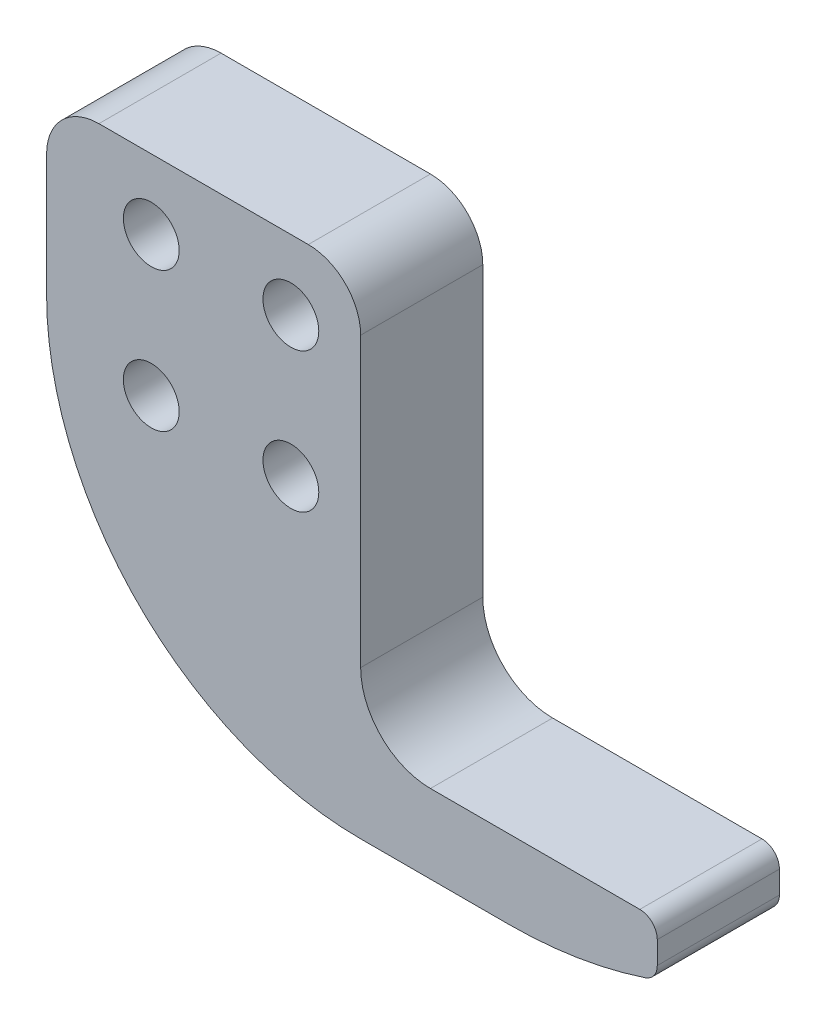
ISO-10303-21;
HEADER;
FILE_DESCRIPTION(('STEP AP214'),'2;1');
FILE_NAME('part.step','',(''),(''),'','','');
FILE_SCHEMA(('AUTOMOTIVE_DESIGN { 1 0 10303 214 1 1 1 1 }'));
ENDSEC;
DATA;
#1=APPLICATION_CONTEXT('core data for automotive mechanical design processes');
#2=APPLICATION_PROTOCOL_DEFINITION('international standard','automotive_design',2000,#1);
#3=PRODUCT_CONTEXT('',#1,'mechanical');
#4=PRODUCT('Part','Part','',(#3));
#5=PRODUCT_RELATED_PRODUCT_CATEGORY('part','',(#4));
#6=PRODUCT_DEFINITION_FORMATION('','',#4);
#7=PRODUCT_DEFINITION_CONTEXT('part definition',#1,'design');
#8=PRODUCT_DEFINITION('design','',#6,#7);
#9=PRODUCT_DEFINITION_SHAPE('','',#8);
#10=(LENGTH_UNIT() NAMED_UNIT(*) SI_UNIT(.MILLI.,.METRE.));
#11=(NAMED_UNIT(*) PLANE_ANGLE_UNIT() SI_UNIT($,.RADIAN.));
#12=(NAMED_UNIT(*) SI_UNIT($,.STERADIAN.) SOLID_ANGLE_UNIT());
#13=UNCERTAINTY_MEASURE_WITH_UNIT(LENGTH_MEASURE(1.E-05),#10,'distance_accuracy_value','');
#14=(GEOMETRIC_REPRESENTATION_CONTEXT(3) GLOBAL_UNCERTAINTY_ASSIGNED_CONTEXT((#13)) GLOBAL_UNIT_ASSIGNED_CONTEXT((#10,
#11,#12)) REPRESENTATION_CONTEXT('',''));
#15=CARTESIAN_POINT('',(0.,0.,0.));
#16=DIRECTION('',(0.,0.,1.));
#17=DIRECTION('',(1.,0.,0.));
#18=AXIS2_PLACEMENT_3D('',#15,#16,#17);
#19=CARTESIAN_POINT('',(-99.1545902943916,66.5,3.5));
#20=DIRECTION('',(0.,0.,1.));
#21=DIRECTION('',(1.,0.,0.));
#22=AXIS2_PLACEMENT_3D('',#19,#20,#21);
#23=PLANE('',#22);
#24=CARTESIAN_POINT('',(-103.154590294392,72.5,3.5));
#25=DIRECTION('',(0.,0.,1.));
#26=DIRECTION('',(1.,0.,0.));
#27=AXIS2_PLACEMENT_3D('',#24,#25,#26);
#28=CIRCLE('',#27,1.59999999999999);
#29=CARTESIAN_POINT('',(-101.554590294392,72.5,3.5));
#30=VERTEX_POINT('',#29);
#31=EDGE_CURVE('E196',#30,#30,#28,.T.);
#32=ORIENTED_EDGE('',*,*,#31,.F.);
#33=EDGE_LOOP('',(#32));
#34=FACE_BOUND('',#33,.T.);
#35=CARTESIAN_POINT('',(-111.154590294392,72.5,3.5));
#36=DIRECTION('',(0.,0.,1.));
#37=DIRECTION('',(1.,0.,0.));
#38=AXIS2_PLACEMENT_3D('',#35,#36,#37);
#39=CIRCLE('',#38,1.59999999999999);
#40=CARTESIAN_POINT('',(-109.554590294392,72.5,3.5));
#41=VERTEX_POINT('',#40);
#42=EDGE_CURVE('E422',#41,#41,#39,.T.);
#43=ORIENTED_EDGE('',*,*,#42,.F.);
#44=EDGE_LOOP('',(#43));
#45=FACE_BOUND('',#44,.T.);
#46=CARTESIAN_POINT('',(-111.154590294392,64.5,3.5));
#47=DIRECTION('',(0.,0.,1.));
#48=DIRECTION('',(1.,0.,0.));
#49=AXIS2_PLACEMENT_3D('',#46,#47,#48);
#50=CIRCLE('',#49,1.59999999999999);
#51=CARTESIAN_POINT('',(-109.554590294392,64.5,3.5));
#52=VERTEX_POINT('',#51);
#53=EDGE_CURVE('E424',#52,#52,#50,.T.);
#54=ORIENTED_EDGE('',*,*,#53,.F.);
#55=EDGE_LOOP('',(#54));
#56=FACE_BOUND('',#55,.T.);
#57=CARTESIAN_POINT('',(-103.154590294392,64.5,3.5));
#58=DIRECTION('',(0.,0.,1.));
#59=DIRECTION('',(1.,0.,0.));
#60=AXIS2_PLACEMENT_3D('',#57,#58,#59);
#61=CIRCLE('',#60,1.60000000000001);
#62=CARTESIAN_POINT('',(-101.554590294392,64.5,3.5));
#63=VERTEX_POINT('',#62);
#64=EDGE_CURVE('E153',#63,#63,#61,.T.);
#65=ORIENTED_EDGE('',*,*,#64,.F.);
#66=EDGE_LOOP('',(#65));
#67=FACE_BOUND('',#66,.T.);
#68=DIRECTION('',(0.,-1.,0.));
#69=VECTOR('',#68,1.);
#70=CARTESIAN_POINT('',(-99.1545902943916,76.5,3.5));
#71=LINE('',#70,#69);
#72=CARTESIAN_POINT('',(-99.1545902943916,73.5,3.5));
#73=VERTEX_POINT('',#72);
#74=CARTESIAN_POINT('',(-99.1545902943916,57.,3.5));
#75=VERTEX_POINT('',#74);
#76=EDGE_CURVE('E249',#73,#75,#71,.T.);
#77=ORIENTED_EDGE('',*,*,#76,.F.);
#78=CARTESIAN_POINT('',(-102.154590294392,73.5,3.5));
#79=DIRECTION('',(0.,0.,1.));
#80=DIRECTION('',(1.,0.,0.));
#81=AXIS2_PLACEMENT_3D('',#78,#79,#80);
#82=CIRCLE('',#81,3.);
#83=CARTESIAN_POINT('',(-102.154590294392,76.5,3.5));
#84=VERTEX_POINT('',#83);
#85=EDGE_CURVE('E235',#73,#84,#82,.T.);
#86=ORIENTED_EDGE('',*,*,#85,.T.);
#87=DIRECTION('',(1.,0.,0.));
#88=VECTOR('',#87,1.);
#89=CARTESIAN_POINT('',(-117.154590294392,76.5,3.5));
#90=LINE('',#89,#88);
#91=CARTESIAN_POINT('',(-114.154590294392,76.5,3.5));
#92=VERTEX_POINT('',#91);
#93=EDGE_CURVE('E186',#92,#84,#90,.T.);
#94=ORIENTED_EDGE('',*,*,#93,.F.);
#95=CARTESIAN_POINT('',(-114.154590294392,73.5,3.5));
#96=DIRECTION('',(0.,0.,1.));
#97=DIRECTION('',(1.,0.,0.));
#98=AXIS2_PLACEMENT_3D('',#95,#96,#97);
#99=CIRCLE('',#98,3.);
#100=CARTESIAN_POINT('',(-117.154590294392,73.5,3.5));
#101=VERTEX_POINT('',#100);
#102=EDGE_CURVE('E233',#92,#101,#99,.T.);
#103=ORIENTED_EDGE('',*,*,#102,.T.);
#104=DIRECTION('',(0.,-1.,0.));
#105=VECTOR('',#104,1.);
#106=CARTESIAN_POINT('',(-117.154590294392,76.5,3.5));
#107=LINE('',#106,#105);
#108=CARTESIAN_POINT('',(-117.154590294392,66.5,3.5));
#109=VERTEX_POINT('',#108);
#110=EDGE_CURVE('E161',#101,#109,#107,.T.);
#111=ORIENTED_EDGE('',*,*,#110,.T.);
#112=CARTESIAN_POINT('',(-99.1545902943916,66.5,3.5));
#113=DIRECTION('',(0.,0.,1.));
#114=DIRECTION('',(1.,0.,0.));
#115=AXIS2_PLACEMENT_3D('',#112,#113,#114);
#116=CIRCLE('',#115,18.);
#117=CARTESIAN_POINT('',(-99.1545902943916,48.5,3.5));
#118=VERTEX_POINT('',#117);
#119=EDGE_CURVE('E157',#109,#118,#116,.T.);
#120=ORIENTED_EDGE('',*,*,#119,.T.);
#121=DIRECTION('',(1.,0.,0.));
#122=VECTOR('',#121,1.);
#123=CARTESIAN_POINT('',(-99.1545902943916,48.5,3.5));
#124=LINE('',#123,#122);
#125=CARTESIAN_POINT('',(-90.6839513490076,48.5,3.5));
#126=VERTEX_POINT('',#125);
#127=EDGE_CURVE('E150',#118,#126,#124,.T.);
#128=ORIENTED_EDGE('',*,*,#127,.T.);
#129=CARTESIAN_POINT('',(-90.6839513490076,73.5,3.5));
#130=DIRECTION('',(0.,0.,-1.));
#131=DIRECTION('',(1.,0.,0.));
#132=AXIS2_PLACEMENT_3D('',#129,#130,#131);
#133=CIRCLE('',#132,25.);
#134=CARTESIAN_POINT('',(-82.840866917116,49.7621393846409,3.5));
#135=VERTEX_POINT('',#134);
#136=EDGE_CURVE('E135',#135,#126,#133,.T.);
#137=ORIENTED_EDGE('',*,*,#136,.F.);
#138=CARTESIAN_POINT('',(-83.1545902943916,50.7116538092553,3.5));
#139=DIRECTION('',(0.,0.,1.));
#140=DIRECTION('',(1.,0.,0.));
#141=AXIS2_PLACEMENT_3D('',#138,#139,#140);
#142=CIRCLE('',#141,1.);
#143=CARTESIAN_POINT('',(-82.1545902943916,50.7116538092553,3.5));
#144=VERTEX_POINT('',#143);
#145=EDGE_CURVE('E216',#135,#144,#142,.T.);
#146=ORIENTED_EDGE('',*,*,#145,.T.);
#147=DIRECTION('',(0.,-1.,0.));
#148=VECTOR('',#147,1.);
#149=CARTESIAN_POINT('',(-82.1545902943916,53.,3.5));
#150=LINE('',#149,#148);
#151=CARTESIAN_POINT('',(-82.1545902943916,52.,3.5));
#152=VERTEX_POINT('',#151);
#153=EDGE_CURVE('E159',#152,#144,#150,.T.);
#154=ORIENTED_EDGE('',*,*,#153,.F.);
#155=CARTESIAN_POINT('',(-83.1545902943916,52.,3.5));
#156=DIRECTION('',(0.,0.,1.));
#157=DIRECTION('',(1.,0.,0.));
#158=AXIS2_PLACEMENT_3D('',#155,#156,#157);
#159=CIRCLE('',#158,1.);
#160=CARTESIAN_POINT('',(-83.1545902943916,53.,3.5));
#161=VERTEX_POINT('',#160);
#162=EDGE_CURVE('E218',#152,#161,#159,.T.);
#163=ORIENTED_EDGE('',*,*,#162,.T.);
#164=DIRECTION('',(1.,0.,0.));
#165=VECTOR('',#164,1.);
#166=CARTESIAN_POINT('',(-99.1545902943916,53.,3.5));
#167=LINE('',#166,#165);
#168=CARTESIAN_POINT('',(-95.1545902943916,53.,3.5));
#169=VERTEX_POINT('',#168);
#170=EDGE_CURVE('E164',#169,#161,#167,.T.);
#171=ORIENTED_EDGE('',*,*,#170,.F.);
#172=CARTESIAN_POINT('',(-95.1545902943916,57.,3.5));
#173=DIRECTION('',(0.,0.,1.));
#174=DIRECTION('',(1.,0.,0.));
#175=AXIS2_PLACEMENT_3D('',#172,#173,#174);
#176=CIRCLE('',#175,4.);
#177=EDGE_CURVE('E11',#169,#75,#176,.F.);
#178=ORIENTED_EDGE('',*,*,#177,.T.);
#179=EDGE_LOOP('',(#77,#86,#94,#103,#111,#120,#128,#137,#146,#154,#163,#171,#178));
#180=FACE_BOUND('',#179,.T.);
#181=ADVANCED_FACE('F41',(#34,#45,#56,#67,#180),#23,.T.);
#182=CARTESIAN_POINT('',(-99.1545902943916,66.5,-3.5));
#183=DIRECTION('',(0.,0.,1.));
#184=DIRECTION('',(1.,0.,0.));
#185=AXIS2_PLACEMENT_3D('',#182,#183,#184);
#186=PLANE('',#185);
#187=CARTESIAN_POINT('',(-103.154590294392,64.5,-3.5));
#188=DIRECTION('',(0.,0.,1.));
#189=DIRECTION('',(1.,0.,0.));
#190=AXIS2_PLACEMENT_3D('',#187,#188,#189);
#191=CIRCLE('',#190,1.60000000000001);
#192=CARTESIAN_POINT('',(-101.554590294392,64.5,-3.5));
#193=VERTEX_POINT('',#192);
#194=EDGE_CURVE('E174',#193,#193,#191,.T.);
#195=ORIENTED_EDGE('',*,*,#194,.T.);
#196=EDGE_LOOP('',(#195));
#197=FACE_BOUND('',#196,.T.);
#198=CARTESIAN_POINT('',(-111.154590294392,64.5,-3.5));
#199=DIRECTION('',(0.,0.,1.));
#200=DIRECTION('',(1.,0.,0.));
#201=AXIS2_PLACEMENT_3D('',#198,#199,#200);
#202=CIRCLE('',#201,1.59999999999999);
#203=CARTESIAN_POINT('',(-109.554590294392,64.5,-3.5));
#204=VERTEX_POINT('',#203);
#205=EDGE_CURVE('E199',#204,#204,#202,.T.);
#206=ORIENTED_EDGE('',*,*,#205,.T.);
#207=EDGE_LOOP('',(#206));
#208=FACE_BOUND('',#207,.T.);
#209=CARTESIAN_POINT('',(-111.154590294392,72.5,-3.5));
#210=DIRECTION('',(0.,0.,1.));
#211=DIRECTION('',(1.,0.,0.));
#212=AXIS2_PLACEMENT_3D('',#209,#210,#211);
#213=CIRCLE('',#212,1.59999999999999);
#214=CARTESIAN_POINT('',(-109.554590294392,72.5,-3.5));
#215=VERTEX_POINT('',#214);
#216=EDGE_CURVE('E195',#215,#215,#213,.T.);
#217=ORIENTED_EDGE('',*,*,#216,.T.);
#218=EDGE_LOOP('',(#217));
#219=FACE_BOUND('',#218,.T.);
#220=CARTESIAN_POINT('',(-103.154590294392,72.5,-3.5));
#221=DIRECTION('',(0.,0.,1.));
#222=DIRECTION('',(1.,0.,0.));
#223=AXIS2_PLACEMENT_3D('',#220,#221,#222);
#224=CIRCLE('',#223,1.59999999999999);
#225=CARTESIAN_POINT('',(-101.554590294392,72.5,-3.5));
#226=VERTEX_POINT('',#225);
#227=EDGE_CURVE('E192',#226,#226,#224,.T.);
#228=ORIENTED_EDGE('',*,*,#227,.T.);
#229=EDGE_LOOP('',(#228));
#230=FACE_BOUND('',#229,.T.);
#231=DIRECTION('',(1.,0.,0.));
#232=VECTOR('',#231,1.);
#233=CARTESIAN_POINT('',(-117.154590294392,76.5,-3.5));
#234=LINE('',#233,#232);
#235=CARTESIAN_POINT('',(-114.154590294392,76.5,-3.5));
#236=VERTEX_POINT('',#235);
#237=CARTESIAN_POINT('',(-102.154590294392,76.5,-3.5));
#238=VERTEX_POINT('',#237);
#239=EDGE_CURVE('E170',#236,#238,#234,.T.);
#240=ORIENTED_EDGE('',*,*,#239,.T.);
#241=CARTESIAN_POINT('',(-102.154590294392,73.5,-3.5));
#242=DIRECTION('',(0.,0.,1.));
#243=DIRECTION('',(1.,0.,0.));
#244=AXIS2_PLACEMENT_3D('',#241,#242,#243);
#245=CIRCLE('',#244,3.);
#246=CARTESIAN_POINT('',(-99.1545902943916,73.5,-3.5));
#247=VERTEX_POINT('',#246);
#248=EDGE_CURVE('E229',#238,#247,#245,.F.);
#249=ORIENTED_EDGE('',*,*,#248,.T.);
#250=DIRECTION('',(0.,-1.,0.));
#251=VECTOR('',#250,1.);
#252=CARTESIAN_POINT('',(-99.1545902943916,76.5,-3.5));
#253=LINE('',#252,#251);
#254=CARTESIAN_POINT('',(-99.1545902943916,57.,-3.5));
#255=VERTEX_POINT('',#254);
#256=EDGE_CURVE('E173',#247,#255,#253,.T.);
#257=ORIENTED_EDGE('',*,*,#256,.T.);
#258=CARTESIAN_POINT('',(-95.1545902943916,57.,-3.5));
#259=DIRECTION('',(0.,0.,1.));
#260=DIRECTION('',(1.,0.,0.));
#261=AXIS2_PLACEMENT_3D('',#258,#259,#260);
#262=CIRCLE('',#261,4.);
#263=CARTESIAN_POINT('',(-95.1545902943916,53.,-3.5));
#264=VERTEX_POINT('',#263);
#265=EDGE_CURVE('E49',#255,#264,#262,.T.);
#266=ORIENTED_EDGE('',*,*,#265,.T.);
#267=DIRECTION('',(1.,0.,0.));
#268=VECTOR('',#267,1.);
#269=CARTESIAN_POINT('',(-99.1545902943916,53.,-3.5));
#270=LINE('',#269,#268);
#271=CARTESIAN_POINT('',(-83.1545902943916,53.,-3.5));
#272=VERTEX_POINT('',#271);
#273=EDGE_CURVE('E176',#264,#272,#270,.T.);
#274=ORIENTED_EDGE('',*,*,#273,.T.);
#275=CARTESIAN_POINT('',(-83.1545902943916,52.,-3.5));
#276=DIRECTION('',(0.,0.,1.));
#277=DIRECTION('',(1.,0.,0.));
#278=AXIS2_PLACEMENT_3D('',#275,#276,#277);
#279=CIRCLE('',#278,1.);
#280=CARTESIAN_POINT('',(-82.1545902943916,52.,-3.5));
#281=VERTEX_POINT('',#280);
#282=EDGE_CURVE('E210',#272,#281,#279,.F.);
#283=ORIENTED_EDGE('',*,*,#282,.T.);
#284=DIRECTION('',(0.,-1.,0.));
#285=VECTOR('',#284,1.);
#286=CARTESIAN_POINT('',(-82.1545902943916,53.,-3.5));
#287=LINE('',#286,#285);
#288=CARTESIAN_POINT('',(-82.1545902943916,50.7116538092553,-3.5));
#289=VERTEX_POINT('',#288);
#290=EDGE_CURVE('E178',#281,#289,#287,.T.);
#291=ORIENTED_EDGE('',*,*,#290,.T.);
#292=CARTESIAN_POINT('',(-83.1545902943916,50.7116538092553,-3.5));
#293=DIRECTION('',(0.,0.,1.));
#294=DIRECTION('',(1.,0.,0.));
#295=AXIS2_PLACEMENT_3D('',#292,#293,#294);
#296=CIRCLE('',#295,1.);
#297=CARTESIAN_POINT('',(-82.840866917116,49.7621393846409,-3.5));
#298=VERTEX_POINT('',#297);
#299=EDGE_CURVE('E208',#289,#298,#296,.F.);
#300=ORIENTED_EDGE('',*,*,#299,.T.);
#301=CARTESIAN_POINT('',(-90.6839513490076,73.5,-3.5));
#302=DIRECTION('',(0.,0.,1.));
#303=DIRECTION('',(1.,0.,0.));
#304=AXIS2_PLACEMENT_3D('',#301,#302,#303);
#305=CIRCLE('',#304,25.);
#306=CARTESIAN_POINT('',(-90.6839513490076,48.5,-3.5));
#307=VERTEX_POINT('',#306);
#308=EDGE_CURVE('E190',#298,#307,#305,.F.);
#309=ORIENTED_EDGE('',*,*,#308,.T.);
#310=DIRECTION('',(1.,0.,0.));
#311=VECTOR('',#310,1.);
#312=CARTESIAN_POINT('',(-99.1545902943916,48.5,-3.5));
#313=LINE('',#312,#311);
#314=CARTESIAN_POINT('',(-99.1545902943916,48.5,-3.5));
#315=VERTEX_POINT('',#314);
#316=EDGE_CURVE('E152',#315,#307,#313,.T.);
#317=ORIENTED_EDGE('',*,*,#316,.F.);
#318=CARTESIAN_POINT('',(-99.1545902943916,66.5,-3.5));
#319=DIRECTION('',(0.,0.,1.));
#320=DIRECTION('',(1.,0.,0.));
#321=AXIS2_PLACEMENT_3D('',#318,#319,#320);
#322=CIRCLE('',#321,18.);
#323=CARTESIAN_POINT('',(-117.154590294392,66.5,-3.5));
#324=VERTEX_POINT('',#323);
#325=EDGE_CURVE('E182',#324,#315,#322,.T.);
#326=ORIENTED_EDGE('',*,*,#325,.F.);
#327=DIRECTION('',(0.,-1.,0.));
#328=VECTOR('',#327,1.);
#329=CARTESIAN_POINT('',(-117.154590294392,76.5,-3.5));
#330=LINE('',#329,#328);
#331=CARTESIAN_POINT('',(-117.154590294392,73.5,-3.5));
#332=VERTEX_POINT('',#331);
#333=EDGE_CURVE('E184',#332,#324,#330,.T.);
#334=ORIENTED_EDGE('',*,*,#333,.F.);
#335=CARTESIAN_POINT('',(-114.154590294392,73.5,-3.5));
#336=DIRECTION('',(0.,0.,1.));
#337=DIRECTION('',(1.,0.,0.));
#338=AXIS2_PLACEMENT_3D('',#335,#336,#337);
#339=CIRCLE('',#338,3.);
#340=EDGE_CURVE('E227',#332,#236,#339,.F.);
#341=ORIENTED_EDGE('',*,*,#340,.T.);
#342=EDGE_LOOP('',(#240,#249,#257,#266,#274,#283,#291,#300,#309,#317,#326,#334,#341));
#343=FACE_BOUND('',#342,.T.);
#344=ADVANCED_FACE('F252',(#197,#208,#219,#230,#343),#186,.F.);
#345=CARTESIAN_POINT('',(-117.154590294392,76.5,3.5));
#346=DIRECTION('',(0.,1.,0.));
#347=DIRECTION('',(0.,0.,1.));
#348=AXIS2_PLACEMENT_3D('',#345,#346,#347);
#349=PLANE('',#348);
#350=ORIENTED_EDGE('',*,*,#93,.T.);
#351=DIRECTION('',(0.,0.,-1.));
#352=VECTOR('',#351,1.);
#353=CARTESIAN_POINT('',(-102.154590294392,76.5,3.5));
#354=LINE('',#353,#352);
#355=EDGE_CURVE('E224',#84,#238,#354,.T.);
#356=ORIENTED_EDGE('',*,*,#355,.T.);
#357=ORIENTED_EDGE('',*,*,#239,.F.);
#358=DIRECTION('',(0.,0.,-1.));
#359=VECTOR('',#358,1.);
#360=CARTESIAN_POINT('',(-114.154590294392,76.5,3.5));
#361=LINE('',#360,#359);
#362=EDGE_CURVE('E222',#236,#92,#361,.F.);
#363=ORIENTED_EDGE('',*,*,#362,.T.);
#364=EDGE_LOOP('',(#350,#356,#357,#363));
#365=FACE_BOUND('',#364,.T.);
#366=ADVANCED_FACE('F260',(#365),#349,.T.);
#367=CARTESIAN_POINT('',(-117.154590294392,76.5,3.5));
#368=DIRECTION('',(1.,0.,0.));
#369=DIRECTION('',(0.,0.,-1.));
#370=AXIS2_PLACEMENT_3D('',#367,#368,#369);
#371=PLANE('',#370);
#372=ORIENTED_EDGE('',*,*,#110,.F.);
#373=DIRECTION('',(0.,0.,-1.));
#374=VECTOR('',#373,1.);
#375=CARTESIAN_POINT('',(-117.154590294392,73.5,-3.5));
#376=LINE('',#375,#374);
#377=EDGE_CURVE('E237',#101,#332,#376,.T.);
#378=ORIENTED_EDGE('',*,*,#377,.T.);
#379=ORIENTED_EDGE('',*,*,#333,.T.);
#380=DIRECTION('',(0.,0.,-1.));
#381=VECTOR('',#380,1.);
#382=CARTESIAN_POINT('',(-117.154590294392,66.5,3.5));
#383=LINE('',#382,#381);
#384=EDGE_CURVE('E187',#109,#324,#383,.T.);
#385=ORIENTED_EDGE('',*,*,#384,.F.);
#386=EDGE_LOOP('',(#372,#378,#379,#385));
#387=FACE_BOUND('',#386,.T.);
#388=ADVANCED_FACE('F290',(#387),#371,.F.);
#389=CARTESIAN_POINT('',(-99.1545902943916,66.5,3.5));
#390=DIRECTION('',(0.,0.,-1.));
#391=DIRECTION('',(-1.,0.,0.));
#392=AXIS2_PLACEMENT_3D('',#389,#390,#391);
#393=CYLINDRICAL_SURFACE('',#392,18.);
#394=ORIENTED_EDGE('',*,*,#325,.T.);
#395=DIRECTION('',(0.,0.,-1.));
#396=VECTOR('',#395,1.);
#397=CARTESIAN_POINT('',(-99.1545902943916,48.5,3.5));
#398=LINE('',#397,#396);
#399=EDGE_CURVE('E169',#118,#315,#398,.T.);
#400=ORIENTED_EDGE('',*,*,#399,.F.);
#401=ORIENTED_EDGE('',*,*,#119,.F.);
#402=ORIENTED_EDGE('',*,*,#384,.T.);
#403=EDGE_LOOP('',(#394,#400,#401,#402));
#404=FACE_BOUND('',#403,.T.);
#405=ADVANCED_FACE('F286',(#404),#393,.T.);
#406=CARTESIAN_POINT('',(-99.1545902943916,48.5,3.5));
#407=DIRECTION('',(0.,1.,0.));
#408=DIRECTION('',(-1.,0.,0.));
#409=AXIS2_PLACEMENT_3D('',#406,#407,#408);
#410=PLANE('',#409);
#411=ORIENTED_EDGE('',*,*,#316,.T.);
#412=DIRECTION('',(0.,0.,1.));
#413=VECTOR('',#412,1.);
#414=CARTESIAN_POINT('',(-90.6839513490076,48.5,-9.5));
#415=LINE('',#414,#413);
#416=EDGE_CURVE('E139',#307,#126,#415,.T.);
#417=ORIENTED_EDGE('',*,*,#416,.T.);
#418=ORIENTED_EDGE('',*,*,#127,.F.);
#419=ORIENTED_EDGE('',*,*,#399,.T.);
#420=EDGE_LOOP('',(#411,#417,#418,#419));
#421=FACE_BOUND('',#420,.T.);
#422=ADVANCED_FACE('F148',(#421),#410,.F.);
#423=CARTESIAN_POINT('',(-82.1545902943916,53.,3.5));
#424=DIRECTION('',(1.,0.,0.));
#425=DIRECTION('',(0.,0.,-1.));
#426=AXIS2_PLACEMENT_3D('',#423,#424,#425);
#427=PLANE('',#426);
#428=ORIENTED_EDGE('',*,*,#290,.F.);
#429=DIRECTION('',(0.,0.,-1.));
#430=VECTOR('',#429,1.);
#431=CARTESIAN_POINT('',(-82.1545902943916,52.,3.5));
#432=LINE('',#431,#430);
#433=EDGE_CURVE('E214',#281,#152,#432,.F.);
#434=ORIENTED_EDGE('',*,*,#433,.T.);
#435=ORIENTED_EDGE('',*,*,#153,.T.);
#436=DIRECTION('',(0.,0.,-1.));
#437=VECTOR('',#436,1.);
#438=CARTESIAN_POINT('',(-82.1545902943916,50.7116538092553,-3.5));
#439=LINE('',#438,#437);
#440=EDGE_CURVE('E212',#144,#289,#439,.T.);
#441=ORIENTED_EDGE('',*,*,#440,.T.);
#442=EDGE_LOOP('',(#428,#434,#435,#441));
#443=FACE_BOUND('',#442,.T.);
#444=ADVANCED_FACE('F279',(#443),#427,.T.);
#445=CARTESIAN_POINT('',(-99.1545902943916,53.,3.5));
#446=DIRECTION('',(0.,1.,0.));
#447=DIRECTION('',(0.,0.,1.));
#448=AXIS2_PLACEMENT_3D('',#445,#446,#447);
#449=PLANE('',#448);
#450=ORIENTED_EDGE('',*,*,#273,.F.);
#451=DIRECTION('',(0.,0.,-1.));
#452=VECTOR('',#451,1.);
#453=CARTESIAN_POINT('',(-95.1545902943916,53.,3.5));
#454=LINE('',#453,#452);
#455=EDGE_CURVE('E62',#264,#169,#454,.F.);
#456=ORIENTED_EDGE('',*,*,#455,.T.);
#457=ORIENTED_EDGE('',*,*,#170,.T.);
#458=DIRECTION('',(0.,0.,-1.));
#459=VECTOR('',#458,1.);
#460=CARTESIAN_POINT('',(-83.1545902943916,53.,3.5));
#461=LINE('',#460,#459);
#462=EDGE_CURVE('E205',#161,#272,#461,.T.);
#463=ORIENTED_EDGE('',*,*,#462,.T.);
#464=EDGE_LOOP('',(#450,#456,#457,#463));
#465=FACE_BOUND('',#464,.T.);
#466=ADVANCED_FACE('F268',(#465),#449,.T.);
#467=CARTESIAN_POINT('',(-99.1545902943916,76.5,3.5));
#468=DIRECTION('',(1.,0.,0.));
#469=DIRECTION('',(0.,0.,-1.));
#470=AXIS2_PLACEMENT_3D('',#467,#468,#469);
#471=PLANE('',#470);
#472=ORIENTED_EDGE('',*,*,#76,.T.);
#473=DIRECTION('',(0.,0.,-1.));
#474=VECTOR('',#473,1.);
#475=CARTESIAN_POINT('',(-99.1545902943916,57.,-3.5));
#476=LINE('',#475,#474);
#477=EDGE_CURVE('E240',#75,#255,#476,.T.);
#478=ORIENTED_EDGE('',*,*,#477,.T.);
#479=ORIENTED_EDGE('',*,*,#256,.F.);
#480=DIRECTION('',(0.,0.,-1.));
#481=VECTOR('',#480,1.);
#482=CARTESIAN_POINT('',(-99.1545902943916,73.5,3.5));
#483=LINE('',#482,#481);
#484=EDGE_CURVE('E231',#247,#73,#483,.F.);
#485=ORIENTED_EDGE('',*,*,#484,.T.);
#486=EDGE_LOOP('',(#472,#478,#479,#485));
#487=FACE_BOUND('',#486,.T.);
#488=ADVANCED_FACE('F247',(#487),#471,.T.);
#489=CARTESIAN_POINT('',(-103.154590294392,72.5,-12.5));
#490=DIRECTION('',(0.,0.,1.));
#491=DIRECTION('',(1.,0.,0.));
#492=AXIS2_PLACEMENT_3D('',#489,#490,#491);
#493=CYLINDRICAL_SURFACE('',#492,1.59999999999999);
#494=ORIENTED_EDGE('',*,*,#31,.T.);
#495=EDGE_LOOP('',(#494));
#496=FACE_BOUND('',#495,.T.);
#497=ORIENTED_EDGE('',*,*,#227,.F.);
#498=EDGE_LOOP('',(#497));
#499=FACE_BOUND('',#498,.T.);
#500=ADVANCED_FACE('F311',(#496,#499),#493,.F.);
#501=CARTESIAN_POINT('',(-111.154590294392,72.5,-12.5));
#502=DIRECTION('',(0.,0.,1.));
#503=DIRECTION('',(1.,0.,0.));
#504=AXIS2_PLACEMENT_3D('',#501,#502,#503);
#505=CYLINDRICAL_SURFACE('',#504,1.59999999999999);
#506=ORIENTED_EDGE('',*,*,#42,.T.);
#507=EDGE_LOOP('',(#506));
#508=FACE_BOUND('',#507,.T.);
#509=ORIENTED_EDGE('',*,*,#216,.F.);
#510=EDGE_LOOP('',(#509));
#511=FACE_BOUND('',#510,.T.);
#512=ADVANCED_FACE('F399',(#508,#511),#505,.F.);
#513=CARTESIAN_POINT('',(-111.154590294392,64.5,-12.5));
#514=DIRECTION('',(0.,0.,1.));
#515=DIRECTION('',(1.,0.,0.));
#516=AXIS2_PLACEMENT_3D('',#513,#514,#515);
#517=CYLINDRICAL_SURFACE('',#516,1.59999999999999);
#518=ORIENTED_EDGE('',*,*,#53,.T.);
#519=EDGE_LOOP('',(#518));
#520=FACE_BOUND('',#519,.T.);
#521=ORIENTED_EDGE('',*,*,#205,.F.);
#522=EDGE_LOOP('',(#521));
#523=FACE_BOUND('',#522,.T.);
#524=ADVANCED_FACE('F395',(#520,#523),#517,.F.);
#525=CARTESIAN_POINT('',(-103.154590294392,64.5,-12.5));
#526=DIRECTION('',(0.,0.,1.));
#527=DIRECTION('',(1.,0.,0.));
#528=AXIS2_PLACEMENT_3D('',#525,#526,#527);
#529=CYLINDRICAL_SURFACE('',#528,1.60000000000001);
#530=ORIENTED_EDGE('',*,*,#64,.T.);
#531=EDGE_LOOP('',(#530));
#532=FACE_BOUND('',#531,.T.);
#533=ORIENTED_EDGE('',*,*,#194,.F.);
#534=EDGE_LOOP('',(#533));
#535=FACE_BOUND('',#534,.T.);
#536=ADVANCED_FACE('F372',(#532,#535),#529,.F.);
#537=CARTESIAN_POINT('',(-90.6839513490076,73.5,-9.5));
#538=DIRECTION('',(0.,0.,1.));
#539=DIRECTION('',(1.,0.,0.));
#540=AXIS2_PLACEMENT_3D('',#537,#538,#539);
#541=CYLINDRICAL_SURFACE('',#540,25.);
#542=ORIENTED_EDGE('',*,*,#308,.F.);
#543=DIRECTION('',(0.,0.,1.));
#544=VECTOR('',#543,1.);
#545=CARTESIAN_POINT('',(-82.840866917116,49.7621393846409,-9.5));
#546=LINE('',#545,#544);
#547=EDGE_CURVE('E142',#298,#135,#546,.T.);
#548=ORIENTED_EDGE('',*,*,#547,.T.);
#549=ORIENTED_EDGE('',*,*,#136,.T.);
#550=ORIENTED_EDGE('',*,*,#416,.F.);
#551=EDGE_LOOP('',(#542,#548,#549,#550));
#552=FACE_BOUND('',#551,.T.);
#553=ADVANCED_FACE('F138',(#552),#541,.T.);
#554=CARTESIAN_POINT('',(-83.1545902943916,52.,3.5));
#555=DIRECTION('',(0.,0.,-1.));
#556=DIRECTION('',(-1.,0.,0.));
#557=AXIS2_PLACEMENT_3D('',#554,#555,#556);
#558=CYLINDRICAL_SURFACE('',#557,1.);
#559=ORIENTED_EDGE('',*,*,#162,.F.);
#560=ORIENTED_EDGE('',*,*,#433,.F.);
#561=ORIENTED_EDGE('',*,*,#282,.F.);
#562=ORIENTED_EDGE('',*,*,#462,.F.);
#563=EDGE_LOOP('',(#559,#560,#561,#562));
#564=FACE_BOUND('',#563,.T.);
#565=ADVANCED_FACE('F275',(#564),#558,.T.);
#566=CARTESIAN_POINT('',(-83.1545902943916,50.7116538092553,-9.5));
#567=DIRECTION('',(0.,0.,1.));
#568=DIRECTION('',(1.,0.,0.));
#569=AXIS2_PLACEMENT_3D('',#566,#567,#568);
#570=CYLINDRICAL_SURFACE('',#569,1.);
#571=ORIENTED_EDGE('',*,*,#299,.F.);
#572=ORIENTED_EDGE('',*,*,#440,.F.);
#573=ORIENTED_EDGE('',*,*,#145,.F.);
#574=ORIENTED_EDGE('',*,*,#547,.F.);
#575=EDGE_LOOP('',(#571,#572,#573,#574));
#576=FACE_BOUND('',#575,.T.);
#577=ADVANCED_FACE('F282',(#576),#570,.T.);
#578=CARTESIAN_POINT('',(-102.154590294392,73.5,3.5));
#579=DIRECTION('',(0.,0.,-1.));
#580=DIRECTION('',(-1.,0.,0.));
#581=AXIS2_PLACEMENT_3D('',#578,#579,#580);
#582=CYLINDRICAL_SURFACE('',#581,3.);
#583=ORIENTED_EDGE('',*,*,#85,.F.);
#584=ORIENTED_EDGE('',*,*,#484,.F.);
#585=ORIENTED_EDGE('',*,*,#248,.F.);
#586=ORIENTED_EDGE('',*,*,#355,.F.);
#587=EDGE_LOOP('',(#583,#584,#585,#586));
#588=FACE_BOUND('',#587,.T.);
#589=ADVANCED_FACE('F257',(#588),#582,.T.);
#590=CARTESIAN_POINT('',(-114.154590294392,73.5,3.5));
#591=DIRECTION('',(0.,0.,1.));
#592=DIRECTION('',(1.,0.,0.));
#593=AXIS2_PLACEMENT_3D('',#590,#591,#592);
#594=CYLINDRICAL_SURFACE('',#593,3.);
#595=ORIENTED_EDGE('',*,*,#102,.F.);
#596=ORIENTED_EDGE('',*,*,#362,.F.);
#597=ORIENTED_EDGE('',*,*,#340,.F.);
#598=ORIENTED_EDGE('',*,*,#377,.F.);
#599=EDGE_LOOP('',(#595,#596,#597,#598));
#600=FACE_BOUND('',#599,.T.);
#601=ADVANCED_FACE('F293',(#600),#594,.T.);
#602=CARTESIAN_POINT('',(-95.1545902943916,57.,3.5));
#603=DIRECTION('',(0.,0.,1.));
#604=DIRECTION('',(1.,0.,0.));
#605=AXIS2_PLACEMENT_3D('',#602,#603,#604);
#606=CYLINDRICAL_SURFACE('',#605,4.);
#607=ORIENTED_EDGE('',*,*,#177,.F.);
#608=ORIENTED_EDGE('',*,*,#455,.F.);
#609=ORIENTED_EDGE('',*,*,#265,.F.);
#610=ORIENTED_EDGE('',*,*,#477,.F.);
#611=EDGE_LOOP('',(#607,#608,#609,#610));
#612=FACE_BOUND('',#611,.T.);
#613=ADVANCED_FACE('F43',(#612),#606,.F.);
#614=CLOSED_SHELL('',(#181,#344,#366,#388,#405,#422,#444,#466,#488,#500,#512,#524,#536,#553,
#565,#577,#589,#601,#613));
#615=MANIFOLD_SOLID_BREP('B2',#614);
#616=ADVANCED_BREP_SHAPE_REPRESENTATION('',(#18,#615),#14);
#617=SHAPE_DEFINITION_REPRESENTATION(#9,#616);
ENDSEC;
END-ISO-10303-21;
